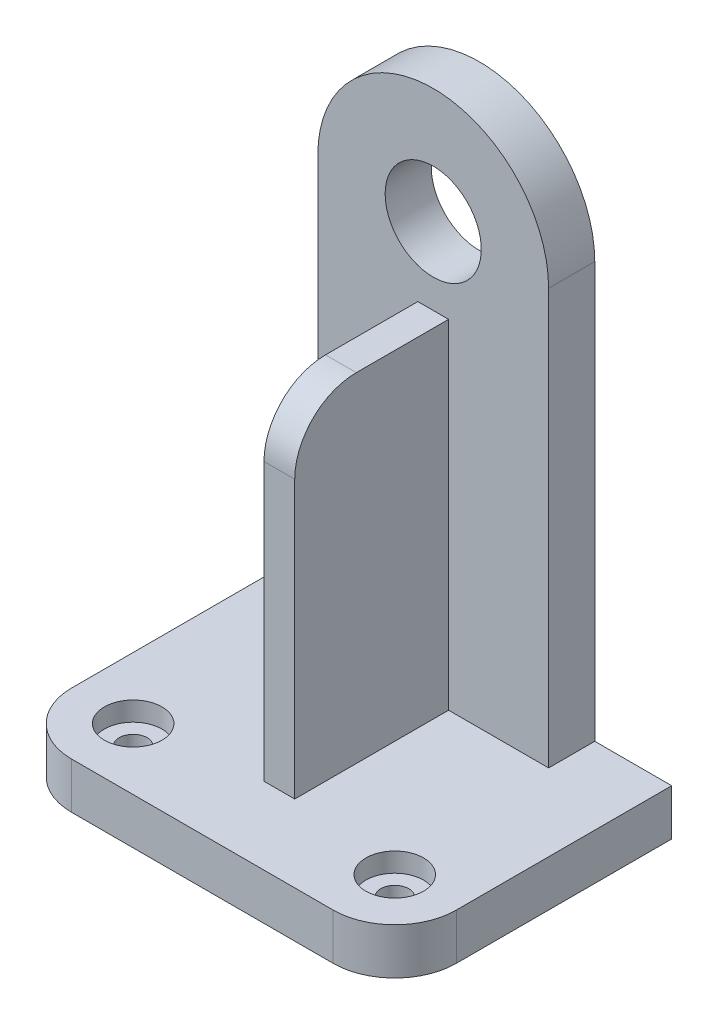
ISO-10303-21;
HEADER;
FILE_DESCRIPTION(('STEP AP214'),'2;1');
FILE_NAME('part.step','',(''),(''),'','','');
FILE_SCHEMA(('AUTOMOTIVE_DESIGN { 1 0 10303 214 1 1 1 1 }'));
ENDSEC;
DATA;
#1=APPLICATION_CONTEXT('core data for automotive mechanical design processes');
#2=APPLICATION_PROTOCOL_DEFINITION('international standard','automotive_design',2000,#1);
#3=PRODUCT_CONTEXT('',#1,'mechanical');
#4=PRODUCT('Part','Part','',(#3));
#5=PRODUCT_RELATED_PRODUCT_CATEGORY('part','',(#4));
#6=PRODUCT_DEFINITION_FORMATION('','',#4);
#7=PRODUCT_DEFINITION_CONTEXT('part definition',#1,'design');
#8=PRODUCT_DEFINITION('design','',#6,#7);
#9=PRODUCT_DEFINITION_SHAPE('','',#8);
#10=(LENGTH_UNIT() NAMED_UNIT(*) SI_UNIT(.MILLI.,.METRE.));
#11=(NAMED_UNIT(*) PLANE_ANGLE_UNIT() SI_UNIT($,.RADIAN.));
#12=(NAMED_UNIT(*) SI_UNIT($,.STERADIAN.) SOLID_ANGLE_UNIT());
#13=UNCERTAINTY_MEASURE_WITH_UNIT(LENGTH_MEASURE(1.E-05),#10,'distance_accuracy_value','');
#14=(GEOMETRIC_REPRESENTATION_CONTEXT(3) GLOBAL_UNCERTAINTY_ASSIGNED_CONTEXT((#13)) GLOBAL_UNIT_ASSIGNED_CONTEXT((#10,
#11,#12)) REPRESENTATION_CONTEXT('',''));
#15=CARTESIAN_POINT('',(0.,0.,0.));
#16=DIRECTION('',(0.,0.,1.));
#17=DIRECTION('',(1.,0.,0.));
#18=AXIS2_PLACEMENT_3D('',#15,#16,#17);
#19=CARTESIAN_POINT('',(34.,12.,20.));
#20=DIRECTION('',(0.,1.,0.));
#21=DIRECTION('',(0.,0.,1.));
#22=AXIS2_PLACEMENT_3D('',#19,#20,#21);
#23=PLANE('',#22);
#24=CARTESIAN_POINT('',(-34.,12.,20.));
#25=DIRECTION('',(0.,1.,0.));
#26=DIRECTION('',(0.,0.,1.));
#27=AXIS2_PLACEMENT_3D('',#24,#25,#26);
#28=CIRCLE('',#27,7.5);
#29=CARTESIAN_POINT('',(-34.,12.,27.5));
#30=VERTEX_POINT('',#29);
#31=EDGE_CURVE('E212',#30,#30,#28,.T.);
#32=ORIENTED_EDGE('',*,*,#31,.F.);
#33=EDGE_LOOP('',(#32));
#34=FACE_BOUND('',#33,.T.);
#35=CARTESIAN_POINT('',(34.,12.,20.));
#36=DIRECTION('',(0.,1.,0.));
#37=DIRECTION('',(0.,0.,1.));
#38=AXIS2_PLACEMENT_3D('',#35,#36,#37);
#39=CIRCLE('',#38,7.5);
#40=CARTESIAN_POINT('',(34.,12.,27.5));
#41=VERTEX_POINT('',#40);
#42=EDGE_CURVE('E215',#41,#41,#39,.T.);
#43=ORIENTED_EDGE('',*,*,#42,.F.);
#44=EDGE_LOOP('',(#43));
#45=FACE_BOUND('',#44,.T.);
#46=DIRECTION('',(1.,0.,0.));
#47=VECTOR('',#46,1.);
#48=CARTESIAN_POINT('',(0.,12.,-24.));
#49=LINE('',#48,#47);
#50=CARTESIAN_POINT('',(4.,12.,-24.));
#51=VERTEX_POINT('',#50);
#52=CARTESIAN_POINT('',(30.,12.,-24.));
#53=VERTEX_POINT('',#52);
#54=EDGE_CURVE('E185',#51,#53,#49,.T.);
#55=ORIENTED_EDGE('',*,*,#54,.F.);
#56=DIRECTION('',(0.,0.,-1.));
#57=VECTOR('',#56,1.);
#58=CARTESIAN_POINT('',(4.,12.,-24.));
#59=LINE('',#58,#57);
#60=CARTESIAN_POINT('',(4.,12.,16.));
#61=VERTEX_POINT('',#60);
#62=EDGE_CURVE('E159',#61,#51,#59,.T.);
#63=ORIENTED_EDGE('',*,*,#62,.F.);
#64=DIRECTION('',(-1.,0.,0.));
#65=VECTOR('',#64,1.);
#66=CARTESIAN_POINT('',(4.,12.,16.));
#67=LINE('',#66,#65);
#68=CARTESIAN_POINT('',(-4.,12.,16.));
#69=VERTEX_POINT('',#68);
#70=EDGE_CURVE('E169',#61,#69,#67,.T.);
#71=ORIENTED_EDGE('',*,*,#70,.T.);
#72=DIRECTION('',(0.,0.,-1.));
#73=VECTOR('',#72,1.);
#74=CARTESIAN_POINT('',(-4.,12.,-24.));
#75=LINE('',#74,#73);
#76=CARTESIAN_POINT('',(-4.,12.,-24.));
#77=VERTEX_POINT('',#76);
#78=EDGE_CURVE('E162',#69,#77,#75,.T.);
#79=ORIENTED_EDGE('',*,*,#78,.T.);
#80=CARTESIAN_POINT('',(-30.,12.,-24.));
#81=VERTEX_POINT('',#80);
#82=EDGE_CURVE('E186',#81,#77,#49,.T.);
#83=ORIENTED_EDGE('',*,*,#82,.F.);
#84=DIRECTION('',(0.,0.,-1.));
#85=VECTOR('',#84,1.);
#86=CARTESIAN_POINT('',(-30.,12.,-24.));
#87=LINE('',#86,#85);
#88=CARTESIAN_POINT('',(-30.,12.,-36.));
#89=VERTEX_POINT('',#88);
#90=EDGE_CURVE('E199',#81,#89,#87,.T.);
#91=ORIENTED_EDGE('',*,*,#90,.T.);
#92=DIRECTION('',(1.,0.,0.));
#93=VECTOR('',#92,1.);
#94=CARTESIAN_POINT('',(-50.,12.,-36.));
#95=LINE('',#94,#93);
#96=CARTESIAN_POINT('',(-50.,12.,-36.));
#97=VERTEX_POINT('',#96);
#98=EDGE_CURVE('E228',#97,#89,#95,.T.);
#99=ORIENTED_EDGE('',*,*,#98,.F.);
#100=DIRECTION('',(0.,0.,1.));
#101=VECTOR('',#100,1.);
#102=CARTESIAN_POINT('',(-50.,12.,-36.));
#103=LINE('',#102,#101);
#104=CARTESIAN_POINT('',(-50.,12.,19.9999999999999));
#105=VERTEX_POINT('',#104);
#106=EDGE_CURVE('E241',#97,#105,#103,.T.);
#107=ORIENTED_EDGE('',*,*,#106,.T.);
#108=CARTESIAN_POINT('',(-34.,12.,20.));
#109=DIRECTION('',(0.,1.,0.));
#110=DIRECTION('',(0.,0.,1.));
#111=AXIS2_PLACEMENT_3D('',#108,#109,#110);
#112=CIRCLE('',#111,16.);
#113=CARTESIAN_POINT('',(-34.,12.,36.));
#114=VERTEX_POINT('',#113);
#115=EDGE_CURVE('E239',#105,#114,#112,.T.);
#116=ORIENTED_EDGE('',*,*,#115,.T.);
#117=DIRECTION('',(1.,0.,0.));
#118=VECTOR('',#117,1.);
#119=CARTESIAN_POINT('',(-33.9999999999999,12.,36.));
#120=LINE('',#119,#118);
#121=CARTESIAN_POINT('',(33.9999999999999,12.,36.));
#122=VERTEX_POINT('',#121);
#123=EDGE_CURVE('E237',#114,#122,#120,.T.);
#124=ORIENTED_EDGE('',*,*,#123,.T.);
#125=CARTESIAN_POINT('',(34.,12.,20.));
#126=DIRECTION('',(0.,1.,0.));
#127=DIRECTION('',(0.,0.,1.));
#128=AXIS2_PLACEMENT_3D('',#125,#126,#127);
#129=CIRCLE('',#128,16.);
#130=CARTESIAN_POINT('',(50.,12.,19.9999999999999));
#131=VERTEX_POINT('',#130);
#132=EDGE_CURVE('E235',#122,#131,#129,.T.);
#133=ORIENTED_EDGE('',*,*,#132,.T.);
#134=DIRECTION('',(0.,0.,1.));
#135=VECTOR('',#134,1.);
#136=CARTESIAN_POINT('',(50.,12.,-36.));
#137=LINE('',#136,#135);
#138=CARTESIAN_POINT('',(50.,12.,-36.));
#139=VERTEX_POINT('',#138);
#140=EDGE_CURVE('E231',#139,#131,#137,.T.);
#141=ORIENTED_EDGE('',*,*,#140,.F.);
#142=CARTESIAN_POINT('',(30.,12.,-36.));
#143=VERTEX_POINT('',#142);
#144=EDGE_CURVE('E232',#143,#139,#95,.T.);
#145=ORIENTED_EDGE('',*,*,#144,.F.);
#146=DIRECTION('',(0.,0.,-1.));
#147=VECTOR('',#146,1.);
#148=CARTESIAN_POINT('',(30.,12.,-24.));
#149=LINE('',#148,#147);
#150=EDGE_CURVE('E203',#53,#143,#149,.T.);
#151=ORIENTED_EDGE('',*,*,#150,.F.);
#152=EDGE_LOOP('',(#55,#63,#71,#79,#83,#91,#99,#107,#116,#124,#133,#141,#145,#151));
#153=FACE_BOUND('',#152,.T.);
#154=ADVANCED_FACE('F43',(#34,#45,#153),#23,.T.);
#155=CARTESIAN_POINT('',(0.,0.,-24.));
#156=DIRECTION('',(0.,0.,-1.));
#157=DIRECTION('',(-1.,0.,0.));
#158=AXIS2_PLACEMENT_3D('',#155,#156,#157);
#159=PLANE('',#158);
#160=CARTESIAN_POINT('',(0.,120.,-24.));
#161=DIRECTION('',(0.,0.,-1.));
#162=DIRECTION('',(-1.,0.,0.));
#163=AXIS2_PLACEMENT_3D('',#160,#161,#162);
#164=CIRCLE('',#163,12.5);
#165=CARTESIAN_POINT('',(-12.5,120.,-24.));
#166=VERTEX_POINT('',#165);
#167=EDGE_CURVE('E188',#166,#166,#164,.T.);
#168=ORIENTED_EDGE('',*,*,#167,.T.);
#169=EDGE_LOOP('',(#168));
#170=FACE_BOUND('',#169,.T.);
#171=DIRECTION('',(0.,1.,0.));
#172=VECTOR('',#171,1.);
#173=CARTESIAN_POINT('',(4.,100.,-24.));
#174=LINE('',#173,#172);
#175=CARTESIAN_POINT('',(4.,100.,-24.));
#176=VERTEX_POINT('',#175);
#177=EDGE_CURVE('E154',#51,#176,#174,.T.);
#178=ORIENTED_EDGE('',*,*,#177,.F.);
#179=ORIENTED_EDGE('',*,*,#54,.T.);
#180=DIRECTION('',(0.,1.,0.));
#181=VECTOR('',#180,1.);
#182=CARTESIAN_POINT('',(30.,0.,-24.));
#183=LINE('',#182,#181);
#184=CARTESIAN_POINT('',(30.,120.,-24.));
#185=VERTEX_POINT('',#184);
#186=EDGE_CURVE('E183',#53,#185,#183,.T.);
#187=ORIENTED_EDGE('',*,*,#186,.T.);
#188=CARTESIAN_POINT('',(0.,120.,-24.));
#189=DIRECTION('',(0.,0.,-1.));
#190=DIRECTION('',(-1.,0.,0.));
#191=AXIS2_PLACEMENT_3D('',#188,#189,#190);
#192=CIRCLE('',#191,30.);
#193=CARTESIAN_POINT('',(-30.,120.,-24.));
#194=VERTEX_POINT('',#193);
#195=EDGE_CURVE('E179',#194,#185,#192,.T.);
#196=ORIENTED_EDGE('',*,*,#195,.F.);
#197=DIRECTION('',(0.,-1.,0.));
#198=VECTOR('',#197,1.);
#199=CARTESIAN_POINT('',(-30.,0.,-24.));
#200=LINE('',#199,#198);
#201=EDGE_CURVE('E177',#194,#81,#200,.T.);
#202=ORIENTED_EDGE('',*,*,#201,.T.);
#203=ORIENTED_EDGE('',*,*,#82,.T.);
#204=DIRECTION('',(0.,1.,0.));
#205=VECTOR('',#204,1.);
#206=CARTESIAN_POINT('',(-4.,100.,-24.));
#207=LINE('',#206,#205);
#208=CARTESIAN_POINT('',(-4.,100.,-24.));
#209=VERTEX_POINT('',#208);
#210=EDGE_CURVE('E167',#77,#209,#207,.T.);
#211=ORIENTED_EDGE('',*,*,#210,.T.);
#212=DIRECTION('',(-1.,0.,0.));
#213=VECTOR('',#212,1.);
#214=CARTESIAN_POINT('',(4.,100.,-24.));
#215=LINE('',#214,#213);
#216=EDGE_CURVE('E150',#176,#209,#215,.T.);
#217=ORIENTED_EDGE('',*,*,#216,.F.);
#218=EDGE_LOOP('',(#178,#179,#187,#196,#202,#203,#211,#217));
#219=FACE_BOUND('',#218,.T.);
#220=ADVANCED_FACE('F165',(#170,#219),#159,.F.);
#221=CARTESIAN_POINT('',(-34.,12.,20.));
#222=DIRECTION('',(0.,-1.,0.));
#223=DIRECTION('',(0.,0.,-1.));
#224=AXIS2_PLACEMENT_3D('',#221,#222,#223);
#225=CYLINDRICAL_SURFACE('',#224,3.6356738497027);
#226=CARTESIAN_POINT('',(-34.,0.,20.));
#227=DIRECTION('',(0.,1.,0.));
#228=DIRECTION('',(0.,0.,1.));
#229=AXIS2_PLACEMENT_3D('',#226,#227,#228);
#230=CIRCLE('',#229,3.6356738497027);
#231=CARTESIAN_POINT('',(-34.,0.,23.6356738497027));
#232=VERTEX_POINT('',#231);
#233=EDGE_CURVE('E224',#232,#232,#230,.T.);
#234=ORIENTED_EDGE('',*,*,#233,.F.);
#235=EDGE_LOOP('',(#234));
#236=FACE_BOUND('',#235,.T.);
#237=CARTESIAN_POINT('',(-34.,7.,20.));
#238=DIRECTION('',(0.,1.,0.));
#239=DIRECTION('',(0.,0.,1.));
#240=AXIS2_PLACEMENT_3D('',#237,#238,#239);
#241=CIRCLE('',#240,3.6356738497027);
#242=CARTESIAN_POINT('',(-34.,7.,23.6356738497027));
#243=VERTEX_POINT('',#242);
#244=EDGE_CURVE('E227',#243,#243,#241,.T.);
#245=ORIENTED_EDGE('',*,*,#244,.T.);
#246=EDGE_LOOP('',(#245));
#247=FACE_BOUND('',#246,.T.);
#248=ADVANCED_FACE('F367',(#236,#247),#225,.F.);
#249=CARTESIAN_POINT('',(34.,12.,20.));
#250=DIRECTION('',(0.,-1.,0.));
#251=DIRECTION('',(0.,0.,-1.));
#252=AXIS2_PLACEMENT_3D('',#249,#250,#251);
#253=CYLINDRICAL_SURFACE('',#252,3.63567384970269);
#254=CARTESIAN_POINT('',(34.,0.,20.));
#255=DIRECTION('',(0.,1.,0.));
#256=DIRECTION('',(0.,0.,1.));
#257=AXIS2_PLACEMENT_3D('',#254,#255,#256);
#258=CIRCLE('',#257,3.63567384970269);
#259=CARTESIAN_POINT('',(34.,0.,23.6356738497027));
#260=VERTEX_POINT('',#259);
#261=EDGE_CURVE('E220',#260,#260,#258,.T.);
#262=ORIENTED_EDGE('',*,*,#261,.F.);
#263=EDGE_LOOP('',(#262));
#264=FACE_BOUND('',#263,.T.);
#265=CARTESIAN_POINT('',(34.,7.,20.));
#266=DIRECTION('',(0.,1.,0.));
#267=DIRECTION('',(0.,0.,1.));
#268=AXIS2_PLACEMENT_3D('',#265,#266,#267);
#269=CIRCLE('',#268,3.63567384970269);
#270=CARTESIAN_POINT('',(34.,7.,23.6356738497027));
#271=VERTEX_POINT('',#270);
#272=EDGE_CURVE('E211',#271,#271,#269,.T.);
#273=ORIENTED_EDGE('',*,*,#272,.T.);
#274=EDGE_LOOP('',(#273));
#275=FACE_BOUND('',#274,.T.);
#276=ADVANCED_FACE('F374',(#264,#275),#253,.F.);
#277=CARTESIAN_POINT('',(-50.,12.,-36.));
#278=DIRECTION('',(0.,0.,-1.));
#279=DIRECTION('',(-1.,0.,0.));
#280=AXIS2_PLACEMENT_3D('',#277,#278,#279);
#281=PLANE('',#280);
#282=DIRECTION('',(1.,0.,0.));
#283=VECTOR('',#282,1.);
#284=CARTESIAN_POINT('',(-50.,0.,-36.));
#285=LINE('',#284,#283);
#286=CARTESIAN_POINT('',(-50.,0.,-36.));
#287=VERTEX_POINT('',#286);
#288=CARTESIAN_POINT('',(50.,0.,-36.));
#289=VERTEX_POINT('',#288);
#290=EDGE_CURVE('E223',#287,#289,#285,.T.);
#291=ORIENTED_EDGE('',*,*,#290,.F.);
#292=DIRECTION('',(0.,-1.,0.));
#293=VECTOR('',#292,1.);
#294=CARTESIAN_POINT('',(-50.,12.,-36.));
#295=LINE('',#294,#293);
#296=EDGE_CURVE('E258',#97,#287,#295,.T.);
#297=ORIENTED_EDGE('',*,*,#296,.F.);
#298=ORIENTED_EDGE('',*,*,#98,.T.);
#299=DIRECTION('',(0.,-1.,0.));
#300=VECTOR('',#299,1.);
#301=CARTESIAN_POINT('',(-30.,0.,-36.));
#302=LINE('',#301,#300);
#303=CARTESIAN_POINT('',(-30.,120.,-36.));
#304=VERTEX_POINT('',#303);
#305=EDGE_CURVE('E168',#304,#89,#302,.T.);
#306=ORIENTED_EDGE('',*,*,#305,.F.);
#307=CARTESIAN_POINT('',(0.,120.,-36.));
#308=DIRECTION('',(0.,0.,-1.));
#309=DIRECTION('',(-1.,0.,0.));
#310=AXIS2_PLACEMENT_3D('',#307,#308,#309);
#311=CIRCLE('',#310,30.);
#312=CARTESIAN_POINT('',(30.,120.,-36.));
#313=VERTEX_POINT('',#312);
#314=EDGE_CURVE('E171',#304,#313,#311,.T.);
#315=ORIENTED_EDGE('',*,*,#314,.T.);
#316=DIRECTION('',(0.,1.,0.));
#317=VECTOR('',#316,1.);
#318=CARTESIAN_POINT('',(30.,0.,-36.));
#319=LINE('',#318,#317);
#320=EDGE_CURVE('E194',#143,#313,#319,.T.);
#321=ORIENTED_EDGE('',*,*,#320,.F.);
#322=ORIENTED_EDGE('',*,*,#144,.T.);
#323=DIRECTION('',(0.,-1.,0.));
#324=VECTOR('',#323,1.);
#325=CARTESIAN_POINT('',(50.,12.,-36.));
#326=LINE('',#325,#324);
#327=EDGE_CURVE('E243',#139,#289,#326,.T.);
#328=ORIENTED_EDGE('',*,*,#327,.T.);
#329=EDGE_LOOP('',(#291,#297,#298,#306,#315,#321,#322,#328));
#330=FACE_BOUND('',#329,.T.);
#331=CARTESIAN_POINT('',(0.,120.,-36.));
#332=DIRECTION('',(0.,0.,-1.));
#333=DIRECTION('',(-1.,0.,0.));
#334=AXIS2_PLACEMENT_3D('',#331,#332,#333);
#335=CIRCLE('',#334,12.5);
#336=CARTESIAN_POINT('',(-12.5,120.,-36.));
#337=VERTEX_POINT('',#336);
#338=EDGE_CURVE('E180',#337,#337,#335,.T.);
#339=ORIENTED_EDGE('',*,*,#338,.F.);
#340=EDGE_LOOP('',(#339));
#341=FACE_BOUND('',#340,.T.);
#342=ADVANCED_FACE('F316',(#330,#341),#281,.T.);
#343=CARTESIAN_POINT('',(-50.,12.,-36.));
#344=DIRECTION('',(1.,0.,0.));
#345=DIRECTION('',(0.,0.,-1.));
#346=AXIS2_PLACEMENT_3D('',#343,#344,#345);
#347=PLANE('',#346);
#348=DIRECTION('',(0.,0.,1.));
#349=VECTOR('',#348,1.);
#350=CARTESIAN_POINT('',(-50.,0.,-36.));
#351=LINE('',#350,#349);
#352=CARTESIAN_POINT('',(-50.,0.,19.9999999999999));
#353=VERTEX_POINT('',#352);
#354=EDGE_CURVE('E256',#287,#353,#351,.T.);
#355=ORIENTED_EDGE('',*,*,#354,.T.);
#356=DIRECTION('',(0.,-1.,0.));
#357=VECTOR('',#356,1.);
#358=CARTESIAN_POINT('',(-50.,12.,19.9999999999999));
#359=LINE('',#358,#357);
#360=EDGE_CURVE('E261',#105,#353,#359,.T.);
#361=ORIENTED_EDGE('',*,*,#360,.F.);
#362=ORIENTED_EDGE('',*,*,#106,.F.);
#363=ORIENTED_EDGE('',*,*,#296,.T.);
#364=EDGE_LOOP('',(#355,#361,#362,#363));
#365=FACE_BOUND('',#364,.T.);
#366=ADVANCED_FACE('F322',(#365),#347,.F.);
#367=CARTESIAN_POINT('',(-34.,12.,20.));
#368=DIRECTION('',(0.,-1.,0.));
#369=DIRECTION('',(0.,0.,-1.));
#370=AXIS2_PLACEMENT_3D('',#367,#368,#369);
#371=CYLINDRICAL_SURFACE('',#370,16.);
#372=CARTESIAN_POINT('',(-34.,0.,20.));
#373=DIRECTION('',(0.,1.,0.));
#374=DIRECTION('',(0.,0.,1.));
#375=AXIS2_PLACEMENT_3D('',#372,#373,#374);
#376=CIRCLE('',#375,16.);
#377=CARTESIAN_POINT('',(-34.,0.,36.));
#378=VERTEX_POINT('',#377);
#379=EDGE_CURVE('E254',#353,#378,#376,.T.);
#380=ORIENTED_EDGE('',*,*,#379,.T.);
#381=DIRECTION('',(0.,-1.,0.));
#382=VECTOR('',#381,1.);
#383=CARTESIAN_POINT('',(-34.,12.,36.));
#384=LINE('',#383,#382);
#385=EDGE_CURVE('E264',#114,#378,#384,.T.);
#386=ORIENTED_EDGE('',*,*,#385,.F.);
#387=ORIENTED_EDGE('',*,*,#115,.F.);
#388=ORIENTED_EDGE('',*,*,#360,.T.);
#389=EDGE_LOOP('',(#380,#386,#387,#388));
#390=FACE_BOUND('',#389,.T.);
#391=ADVANCED_FACE('F328',(#390),#371,.T.);
#392=CARTESIAN_POINT('',(-33.9999999999999,12.,36.));
#393=DIRECTION('',(0.,0.,-1.));
#394=DIRECTION('',(-1.,0.,0.));
#395=AXIS2_PLACEMENT_3D('',#392,#393,#394);
#396=PLANE('',#395);
#397=DIRECTION('',(1.,0.,0.));
#398=VECTOR('',#397,1.);
#399=CARTESIAN_POINT('',(-33.9999999999999,0.,36.));
#400=LINE('',#399,#398);
#401=CARTESIAN_POINT('',(33.9999999999999,0.,36.));
#402=VERTEX_POINT('',#401);
#403=EDGE_CURVE('E252',#378,#402,#400,.T.);
#404=ORIENTED_EDGE('',*,*,#403,.T.);
#405=DIRECTION('',(0.,-1.,0.));
#406=VECTOR('',#405,1.);
#407=CARTESIAN_POINT('',(33.9999999999999,12.,36.));
#408=LINE('',#407,#406);
#409=EDGE_CURVE('E267',#122,#402,#408,.T.);
#410=ORIENTED_EDGE('',*,*,#409,.F.);
#411=ORIENTED_EDGE('',*,*,#123,.F.);
#412=ORIENTED_EDGE('',*,*,#385,.T.);
#413=EDGE_LOOP('',(#404,#410,#411,#412));
#414=FACE_BOUND('',#413,.T.);
#415=ADVANCED_FACE('F332',(#414),#396,.F.);
#416=CARTESIAN_POINT('',(34.,12.,20.));
#417=DIRECTION('',(0.,-1.,0.));
#418=DIRECTION('',(0.,0.,-1.));
#419=AXIS2_PLACEMENT_3D('',#416,#417,#418);
#420=CYLINDRICAL_SURFACE('',#419,16.);
#421=CARTESIAN_POINT('',(34.,0.,20.));
#422=DIRECTION('',(0.,1.,0.));
#423=DIRECTION('',(0.,0.,1.));
#424=AXIS2_PLACEMENT_3D('',#421,#422,#423);
#425=CIRCLE('',#424,16.);
#426=CARTESIAN_POINT('',(50.,0.,19.9999999999999));
#427=VERTEX_POINT('',#426);
#428=EDGE_CURVE('E249',#402,#427,#425,.T.);
#429=ORIENTED_EDGE('',*,*,#428,.T.);
#430=DIRECTION('',(0.,-1.,0.));
#431=VECTOR('',#430,1.);
#432=CARTESIAN_POINT('',(50.,12.,19.9999999999999));
#433=LINE('',#432,#431);
#434=EDGE_CURVE('E270',#131,#427,#433,.T.);
#435=ORIENTED_EDGE('',*,*,#434,.F.);
#436=ORIENTED_EDGE('',*,*,#132,.F.);
#437=ORIENTED_EDGE('',*,*,#409,.T.);
#438=EDGE_LOOP('',(#429,#435,#436,#437));
#439=FACE_BOUND('',#438,.T.);
#440=ADVANCED_FACE('F337',(#439),#420,.T.);
#441=CARTESIAN_POINT('',(50.,12.,-36.));
#442=DIRECTION('',(1.,0.,0.));
#443=DIRECTION('',(0.,0.,-1.));
#444=AXIS2_PLACEMENT_3D('',#441,#442,#443);
#445=PLANE('',#444);
#446=DIRECTION('',(0.,0.,1.));
#447=VECTOR('',#446,1.);
#448=CARTESIAN_POINT('',(50.,0.,-36.));
#449=LINE('',#448,#447);
#450=EDGE_CURVE('E246',#289,#427,#449,.T.);
#451=ORIENTED_EDGE('',*,*,#450,.F.);
#452=ORIENTED_EDGE('',*,*,#327,.F.);
#453=ORIENTED_EDGE('',*,*,#140,.T.);
#454=ORIENTED_EDGE('',*,*,#434,.T.);
#455=EDGE_LOOP('',(#451,#452,#453,#454));
#456=FACE_BOUND('',#455,.T.);
#457=ADVANCED_FACE('F342',(#456),#445,.T.);
#458=CARTESIAN_POINT('',(34.,0.,20.));
#459=DIRECTION('',(0.,1.,0.));
#460=DIRECTION('',(0.,0.,1.));
#461=AXIS2_PLACEMENT_3D('',#458,#459,#460);
#462=PLANE('',#461);
#463=ORIENTED_EDGE('',*,*,#261,.T.);
#464=EDGE_LOOP('',(#463));
#465=FACE_BOUND('',#464,.T.);
#466=ORIENTED_EDGE('',*,*,#233,.T.);
#467=EDGE_LOOP('',(#466));
#468=FACE_BOUND('',#467,.T.);
#469=ORIENTED_EDGE('',*,*,#290,.T.);
#470=ORIENTED_EDGE('',*,*,#450,.T.);
#471=ORIENTED_EDGE('',*,*,#428,.F.);
#472=ORIENTED_EDGE('',*,*,#403,.F.);
#473=ORIENTED_EDGE('',*,*,#379,.F.);
#474=ORIENTED_EDGE('',*,*,#354,.F.);
#475=EDGE_LOOP('',(#469,#470,#471,#472,#473,#474));
#476=FACE_BOUND('',#475,.T.);
#477=ADVANCED_FACE('F344',(#465,#468,#476),#462,.F.);
#478=CARTESIAN_POINT('',(34.,7.,20.));
#479=DIRECTION('',(0.,1.,0.));
#480=DIRECTION('',(0.,0.,1.));
#481=AXIS2_PLACEMENT_3D('',#478,#479,#480);
#482=CYLINDRICAL_SURFACE('',#481,7.5);
#483=CARTESIAN_POINT('',(34.,7.,20.));
#484=DIRECTION('',(0.,1.,0.));
#485=DIRECTION('',(0.,0.,1.));
#486=AXIS2_PLACEMENT_3D('',#483,#484,#485);
#487=CIRCLE('',#486,7.5);
#488=CARTESIAN_POINT('',(34.,7.,27.5));
#489=VERTEX_POINT('',#488);
#490=EDGE_CURVE('E202',#489,#489,#487,.T.);
#491=ORIENTED_EDGE('',*,*,#490,.F.);
#492=EDGE_LOOP('',(#491));
#493=FACE_BOUND('',#492,.T.);
#494=ORIENTED_EDGE('',*,*,#42,.T.);
#495=EDGE_LOOP('',(#494));
#496=FACE_BOUND('',#495,.T.);
#497=ADVANCED_FACE('F346',(#493,#496),#482,.F.);
#498=CARTESIAN_POINT('',(34.,7.,20.));
#499=DIRECTION('',(0.,1.,0.));
#500=DIRECTION('',(0.,0.,1.));
#501=AXIS2_PLACEMENT_3D('',#498,#499,#500);
#502=PLANE('',#501);
#503=ORIENTED_EDGE('',*,*,#272,.F.);
#504=EDGE_LOOP('',(#503));
#505=FACE_BOUND('',#504,.T.);
#506=ORIENTED_EDGE('',*,*,#490,.T.);
#507=EDGE_LOOP('',(#506));
#508=FACE_BOUND('',#507,.T.);
#509=ADVANCED_FACE('F354',(#505,#508),#502,.T.);
#510=CARTESIAN_POINT('',(-34.,7.,20.));
#511=DIRECTION('',(0.,1.,0.));
#512=DIRECTION('',(0.,0.,1.));
#513=AXIS2_PLACEMENT_3D('',#510,#511,#512);
#514=CYLINDRICAL_SURFACE('',#513,7.5);
#515=CARTESIAN_POINT('',(-34.,7.,20.));
#516=DIRECTION('',(0.,1.,0.));
#517=DIRECTION('',(0.,0.,1.));
#518=AXIS2_PLACEMENT_3D('',#515,#516,#517);
#519=CIRCLE('',#518,7.5);
#520=CARTESIAN_POINT('',(-34.,7.,27.5));
#521=VERTEX_POINT('',#520);
#522=EDGE_CURVE('E208',#521,#521,#519,.T.);
#523=ORIENTED_EDGE('',*,*,#522,.F.);
#524=EDGE_LOOP('',(#523));
#525=FACE_BOUND('',#524,.T.);
#526=ORIENTED_EDGE('',*,*,#31,.T.);
#527=EDGE_LOOP('',(#526));
#528=FACE_BOUND('',#527,.T.);
#529=ADVANCED_FACE('F380',(#525,#528),#514,.F.);
#530=CARTESIAN_POINT('',(-34.,7.,20.));
#531=DIRECTION('',(0.,1.,0.));
#532=DIRECTION('',(0.,0.,1.));
#533=AXIS2_PLACEMENT_3D('',#530,#531,#532);
#534=PLANE('',#533);
#535=ORIENTED_EDGE('',*,*,#244,.F.);
#536=EDGE_LOOP('',(#535));
#537=FACE_BOUND('',#536,.T.);
#538=ORIENTED_EDGE('',*,*,#522,.T.);
#539=EDGE_LOOP('',(#538));
#540=FACE_BOUND('',#539,.T.);
#541=ADVANCED_FACE('F385',(#537,#540),#534,.T.);
#542=CARTESIAN_POINT('',(-30.,0.,-24.));
#543=DIRECTION('',(1.,0.,0.));
#544=DIRECTION('',(0.,0.,-1.));
#545=AXIS2_PLACEMENT_3D('',#542,#543,#544);
#546=PLANE('',#545);
#547=ORIENTED_EDGE('',*,*,#305,.T.);
#548=ORIENTED_EDGE('',*,*,#90,.F.);
#549=ORIENTED_EDGE('',*,*,#201,.F.);
#550=DIRECTION('',(0.,0.,-1.));
#551=VECTOR('',#550,1.);
#552=CARTESIAN_POINT('',(-30.,120.,-24.));
#553=LINE('',#552,#551);
#554=EDGE_CURVE('E190',#194,#304,#553,.T.);
#555=ORIENTED_EDGE('',*,*,#554,.T.);
#556=EDGE_LOOP('',(#547,#548,#549,#555));
#557=FACE_BOUND('',#556,.T.);
#558=ADVANCED_FACE('F311',(#557),#546,.F.);
#559=CARTESIAN_POINT('',(30.,0.,-24.));
#560=DIRECTION('',(-1.,0.,0.));
#561=DIRECTION('',(0.,0.,1.));
#562=AXIS2_PLACEMENT_3D('',#559,#560,#561);
#563=PLANE('',#562);
#564=ORIENTED_EDGE('',*,*,#320,.T.);
#565=DIRECTION('',(0.,0.,-1.));
#566=VECTOR('',#565,1.);
#567=CARTESIAN_POINT('',(30.,120.,-24.));
#568=LINE('',#567,#566);
#569=EDGE_CURVE('E205',#185,#313,#568,.T.);
#570=ORIENTED_EDGE('',*,*,#569,.F.);
#571=ORIENTED_EDGE('',*,*,#186,.F.);
#572=ORIENTED_EDGE('',*,*,#150,.T.);
#573=EDGE_LOOP('',(#564,#570,#571,#572));
#574=FACE_BOUND('',#573,.T.);
#575=ADVANCED_FACE('F302',(#574),#563,.F.);
#576=CARTESIAN_POINT('',(0.,120.,-24.));
#577=DIRECTION('',(0.,0.,-1.));
#578=DIRECTION('',(-1.,0.,0.));
#579=AXIS2_PLACEMENT_3D('',#576,#577,#578);
#580=CYLINDRICAL_SURFACE('',#579,30.);
#581=ORIENTED_EDGE('',*,*,#314,.F.);
#582=ORIENTED_EDGE('',*,*,#554,.F.);
#583=ORIENTED_EDGE('',*,*,#195,.T.);
#584=ORIENTED_EDGE('',*,*,#569,.T.);
#585=EDGE_LOOP('',(#581,#582,#583,#584));
#586=FACE_BOUND('',#585,.T.);
#587=ADVANCED_FACE('F306',(#586),#580,.T.);
#588=CARTESIAN_POINT('',(0.,120.,-24.));
#589=DIRECTION('',(0.,0.,-1.));
#590=DIRECTION('',(-1.,0.,0.));
#591=AXIS2_PLACEMENT_3D('',#588,#589,#590);
#592=CYLINDRICAL_SURFACE('',#591,12.5);
#593=ORIENTED_EDGE('',*,*,#167,.F.);
#594=EDGE_LOOP('',(#593));
#595=FACE_BOUND('',#594,.T.);
#596=ORIENTED_EDGE('',*,*,#338,.T.);
#597=EDGE_LOOP('',(#596));
#598=FACE_BOUND('',#597,.T.);
#599=ADVANCED_FACE('F394',(#595,#598),#592,.F.);
#600=CARTESIAN_POINT('',(4.,100.,16.));
#601=DIRECTION('',(0.,-1.,0.));
#602=DIRECTION('',(0.,0.,-1.));
#603=AXIS2_PLACEMENT_3D('',#600,#601,#602);
#604=PLANE('',#603);
#605=DIRECTION('',(0.,0.,1.));
#606=VECTOR('',#605,1.);
#607=CARTESIAN_POINT('',(-4.,100.,16.));
#608=LINE('',#607,#606);
#609=CARTESIAN_POINT('',(-4.,100.,0.));
#610=VERTEX_POINT('',#609);
#611=EDGE_CURVE('E289',#209,#610,#608,.T.);
#612=ORIENTED_EDGE('',*,*,#611,.T.);
#613=DIRECTION('',(-1.,0.,0.));
#614=VECTOR('',#613,1.);
#615=CARTESIAN_POINT('',(4.,100.,0.));
#616=LINE('',#615,#614);
#617=CARTESIAN_POINT('',(4.,100.,0.));
#618=VERTEX_POINT('',#617);
#619=EDGE_CURVE('E51',#610,#618,#616,.F.);
#620=ORIENTED_EDGE('',*,*,#619,.T.);
#621=DIRECTION('',(0.,0.,1.));
#622=VECTOR('',#621,1.);
#623=CARTESIAN_POINT('',(4.,100.,16.));
#624=LINE('',#623,#622);
#625=EDGE_CURVE('E146',#176,#618,#624,.T.);
#626=ORIENTED_EDGE('',*,*,#625,.F.);
#627=ORIENTED_EDGE('',*,*,#216,.T.);
#628=EDGE_LOOP('',(#612,#620,#626,#627));
#629=FACE_BOUND('',#628,.T.);
#630=ADVANCED_FACE('F148',(#629),#604,.F.);
#631=CARTESIAN_POINT('',(4.,12.,16.));
#632=DIRECTION('',(0.,0.,-1.));
#633=DIRECTION('',(-1.,0.,0.));
#634=AXIS2_PLACEMENT_3D('',#631,#632,#633);
#635=PLANE('',#634);
#636=DIRECTION('',(0.,-1.,0.));
#637=VECTOR('',#636,1.);
#638=CARTESIAN_POINT('',(4.,12.,16.));
#639=LINE('',#638,#637);
#640=CARTESIAN_POINT('',(4.,84.,16.));
#641=VERTEX_POINT('',#640);
#642=EDGE_CURVE('E153',#641,#61,#639,.T.);
#643=ORIENTED_EDGE('',*,*,#642,.F.);
#644=DIRECTION('',(-1.,0.,0.));
#645=VECTOR('',#644,1.);
#646=CARTESIAN_POINT('',(4.,84.,16.));
#647=LINE('',#646,#645);
#648=CARTESIAN_POINT('',(-4.,84.,16.));
#649=VERTEX_POINT('',#648);
#650=EDGE_CURVE('E260',#641,#649,#647,.T.);
#651=ORIENTED_EDGE('',*,*,#650,.T.);
#652=DIRECTION('',(0.,-1.,0.));
#653=VECTOR('',#652,1.);
#654=CARTESIAN_POINT('',(-4.,12.,16.));
#655=LINE('',#654,#653);
#656=EDGE_CURVE('E284',#649,#69,#655,.T.);
#657=ORIENTED_EDGE('',*,*,#656,.T.);
#658=ORIENTED_EDGE('',*,*,#70,.F.);
#659=EDGE_LOOP('',(#643,#651,#657,#658));
#660=FACE_BOUND('',#659,.T.);
#661=ADVANCED_FACE('F282',(#660),#635,.F.);
#662=CARTESIAN_POINT('',(4.,0.,0.));
#663=DIRECTION('',(-1.,0.,0.));
#664=DIRECTION('',(0.,0.,1.));
#665=AXIS2_PLACEMENT_3D('',#662,#663,#664);
#666=PLANE('',#665);
#667=ORIENTED_EDGE('',*,*,#625,.T.);
#668=CARTESIAN_POINT('',(4.,84.,0.));
#669=DIRECTION('',(-1.,0.,0.));
#670=DIRECTION('',(0.,0.,1.));
#671=AXIS2_PLACEMENT_3D('',#668,#669,#670);
#672=CIRCLE('',#671,16.);
#673=EDGE_CURVE('E11',#618,#641,#672,.F.);
#674=ORIENTED_EDGE('',*,*,#673,.T.);
#675=ORIENTED_EDGE('',*,*,#642,.T.);
#676=ORIENTED_EDGE('',*,*,#62,.T.);
#677=ORIENTED_EDGE('',*,*,#177,.T.);
#678=EDGE_LOOP('',(#667,#674,#675,#676,#677));
#679=FACE_BOUND('',#678,.T.);
#680=ADVANCED_FACE('F157',(#679),#666,.F.);
#681=CARTESIAN_POINT('',(-4.,0.,0.));
#682=DIRECTION('',(-1.,0.,0.));
#683=DIRECTION('',(0.,0.,1.));
#684=AXIS2_PLACEMENT_3D('',#681,#682,#683);
#685=PLANE('',#684);
#686=ORIENTED_EDGE('',*,*,#656,.F.);
#687=CARTESIAN_POINT('',(-4.,84.,0.));
#688=DIRECTION('',(-1.,0.,0.));
#689=DIRECTION('',(0.,0.,1.));
#690=AXIS2_PLACEMENT_3D('',#687,#688,#689);
#691=CIRCLE('',#690,16.);
#692=EDGE_CURVE('E65',#649,#610,#691,.T.);
#693=ORIENTED_EDGE('',*,*,#692,.T.);
#694=ORIENTED_EDGE('',*,*,#611,.F.);
#695=ORIENTED_EDGE('',*,*,#210,.F.);
#696=ORIENTED_EDGE('',*,*,#78,.F.);
#697=EDGE_LOOP('',(#686,#693,#694,#695,#696));
#698=FACE_BOUND('',#697,.T.);
#699=ADVANCED_FACE('F287',(#698),#685,.T.);
#700=CARTESIAN_POINT('',(4.,84.,0.));
#701=DIRECTION('',(-1.,0.,0.));
#702=DIRECTION('',(0.,0.,1.));
#703=AXIS2_PLACEMENT_3D('',#700,#701,#702);
#704=CYLINDRICAL_SURFACE('',#703,16.);
#705=ORIENTED_EDGE('',*,*,#673,.F.);
#706=ORIENTED_EDGE('',*,*,#619,.F.);
#707=ORIENTED_EDGE('',*,*,#692,.F.);
#708=ORIENTED_EDGE('',*,*,#650,.F.);
#709=EDGE_LOOP('',(#705,#706,#707,#708));
#710=FACE_BOUND('',#709,.T.);
#711=ADVANCED_FACE('F45',(#710),#704,.T.);
#712=CLOSED_SHELL('',(#154,#220,#248,#276,#342,#366,#391,#415,#440,#457,#477,#497,#509,#529,
#541,#558,#575,#587,#599,#630,#661,#680,#699,#711));
#713=MANIFOLD_SOLID_BREP('B2',#712);
#714=ADVANCED_BREP_SHAPE_REPRESENTATION('',(#18,#713),#14);
#715=SHAPE_DEFINITION_REPRESENTATION(#9,#714);
ENDSEC;
END-ISO-10303-21;
